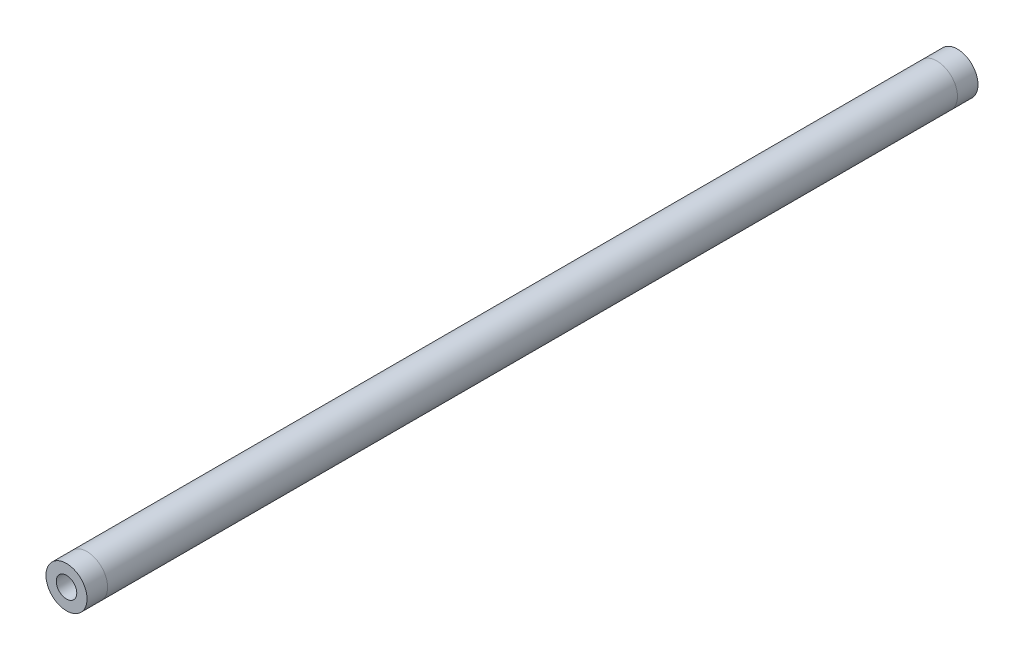
ISO-10303-21;
HEADER;
FILE_DESCRIPTION(('STEP AP214'),'2;1');
FILE_NAME('part.step','',(''),(''),'','','');
FILE_SCHEMA(('AUTOMOTIVE_DESIGN { 1 0 10303 214 1 1 1 1 }'));
ENDSEC;
DATA;
#1=APPLICATION_CONTEXT('core data for automotive mechanical design processes');
#2=APPLICATION_PROTOCOL_DEFINITION('international standard','automotive_design',2000,#1);
#3=PRODUCT_CONTEXT('',#1,'mechanical');
#4=PRODUCT('Part','Part','',(#3));
#5=PRODUCT_RELATED_PRODUCT_CATEGORY('part','',(#4));
#6=PRODUCT_DEFINITION_FORMATION('','',#4);
#7=PRODUCT_DEFINITION_CONTEXT('part definition',#1,'design');
#8=PRODUCT_DEFINITION('design','',#6,#7);
#9=PRODUCT_DEFINITION_SHAPE('','',#8);
#10=(LENGTH_UNIT() NAMED_UNIT(*) SI_UNIT(.MILLI.,.METRE.));
#11=(NAMED_UNIT(*) PLANE_ANGLE_UNIT() SI_UNIT($,.RADIAN.));
#12=(NAMED_UNIT(*) SI_UNIT($,.STERADIAN.) SOLID_ANGLE_UNIT());
#13=UNCERTAINTY_MEASURE_WITH_UNIT(LENGTH_MEASURE(1.E-05),#10,'distance_accuracy_value','');
#14=(GEOMETRIC_REPRESENTATION_CONTEXT(3) GLOBAL_UNCERTAINTY_ASSIGNED_CONTEXT((#13)) GLOBAL_UNIT_ASSIGNED_CONTEXT((#10,
#11,#12)) REPRESENTATION_CONTEXT('',''));
#15=CARTESIAN_POINT('',(0.,0.,0.));
#16=DIRECTION('',(0.,0.,1.));
#17=DIRECTION('',(1.,0.,0.));
#18=AXIS2_PLACEMENT_3D('',#15,#16,#17);
#19=CARTESIAN_POINT('',(0.,0.,-275.389417953208));
#20=DIRECTION('',(0.,0.,1.));
#21=DIRECTION('',(1.,0.,0.));
#22=AXIS2_PLACEMENT_3D('',#19,#20,#21);
#23=CYLINDRICAL_SURFACE('',#22,6.35);
#24=CARTESIAN_POINT('',(0.,0.,-275.389417953208));
#25=DIRECTION('',(0.,0.,1.));
#26=DIRECTION('',(1.,0.,0.));
#27=AXIS2_PLACEMENT_3D('',#24,#25,#26);
#28=CIRCLE('',#27,6.35);
#29=CARTESIAN_POINT('',(6.35,0.,-275.389417953208));
#30=VERTEX_POINT('',#29);
#31=EDGE_CURVE('E83',#30,#30,#28,.T.);
#32=ORIENTED_EDGE('',*,*,#31,.T.);
#33=EDGE_LOOP('',(#32));
#34=FACE_BOUND('',#33,.T.);
#35=CARTESIAN_POINT('',(0.,0.,-269.039417953208));
#36=DIRECTION('',(0.,0.,1.));
#37=DIRECTION('',(1.,0.,0.));
#38=AXIS2_PLACEMENT_3D('',#35,#36,#37);
#39=CIRCLE('',#38,6.35);
#40=CARTESIAN_POINT('',(6.35,0.,-269.039417953208));
#41=VERTEX_POINT('',#40);
#42=EDGE_CURVE('E79',#41,#41,#39,.T.);
#43=ORIENTED_EDGE('',*,*,#42,.F.);
#44=EDGE_LOOP('',(#43));
#45=FACE_BOUND('',#44,.T.);
#46=ADVANCED_FACE('F76',(#34,#45),#23,.T.);
#47=CARTESIAN_POINT('',(0.,0.,-275.389417953208));
#48=DIRECTION('',(0.,0.,1.));
#49=DIRECTION('',(1.,0.,0.));
#50=AXIS2_PLACEMENT_3D('',#47,#48,#49);
#51=PLANE('',#50);
#52=CARTESIAN_POINT('',(0.,0.,-275.389417953208));
#53=DIRECTION('',(0.,0.,1.));
#54=DIRECTION('',(1.,0.,0.));
#55=AXIS2_PLACEMENT_3D('',#52,#53,#54);
#56=CIRCLE('',#55,3.175);
#57=CARTESIAN_POINT('',(3.175,0.,-275.389417953208));
#58=VERTEX_POINT('',#57);
#59=EDGE_CURVE('E92',#58,#58,#56,.T.);
#60=ORIENTED_EDGE('',*,*,#59,.T.);
#61=EDGE_LOOP('',(#60));
#62=FACE_BOUND('',#61,.T.);
#63=ORIENTED_EDGE('',*,*,#31,.F.);
#64=EDGE_LOOP('',(#63));
#65=FACE_BOUND('',#64,.T.);
#66=ADVANCED_FACE('F119',(#62,#65),#51,.F.);
#67=CARTESIAN_POINT('',(0.,0.,-269.039417953208));
#68=DIRECTION('',(0.,0.,1.));
#69=DIRECTION('',(1.,0.,0.));
#70=AXIS2_PLACEMENT_3D('',#67,#68,#69);
#71=PLANE('',#70);
#72=CARTESIAN_POINT('',(0.,0.,-269.039417953208));
#73=DIRECTION('',(0.,0.,1.));
#74=DIRECTION('',(1.,0.,0.));
#75=AXIS2_PLACEMENT_3D('',#72,#73,#74);
#76=CIRCLE('',#75,4.826);
#77=CARTESIAN_POINT('',(-4.826,0.,-269.039417953208));
#78=VERTEX_POINT('',#77);
#79=EDGE_CURVE('E12',#78,#78,#76,.T.);
#80=ORIENTED_EDGE('',*,*,#79,.F.);
#81=EDGE_LOOP('',(#80));
#82=FACE_BOUND('',#81,.T.);
#83=ORIENTED_EDGE('',*,*,#42,.T.);
#84=EDGE_LOOP('',(#83));
#85=FACE_BOUND('',#84,.T.);
#86=ADVANCED_FACE('F115',(#82,#85),#71,.T.);
#87=CARTESIAN_POINT('',(0.,0.,-275.389417953208));
#88=DIRECTION('',(0.,0.,1.));
#89=DIRECTION('',(1.,0.,0.));
#90=AXIS2_PLACEMENT_3D('',#87,#88,#89);
#91=CYLINDRICAL_SURFACE('',#90,3.175);
#92=ORIENTED_EDGE('',*,*,#59,.F.);
#93=EDGE_LOOP('',(#92));
#94=FACE_BOUND('',#93,.T.);
#95=CARTESIAN_POINT('',(0.,0.,-259.514417953208));
#96=DIRECTION('',(0.,0.,1.));
#97=DIRECTION('',(1.,0.,0.));
#98=AXIS2_PLACEMENT_3D('',#95,#96,#97);
#99=CIRCLE('',#98,3.175);
#100=CARTESIAN_POINT('',(3.175,0.,-259.514417953208));
#101=VERTEX_POINT('',#100);
#102=EDGE_CURVE('E98',#101,#101,#99,.T.);
#103=ORIENTED_EDGE('',*,*,#102,.T.);
#104=EDGE_LOOP('',(#103));
#105=FACE_BOUND('',#104,.T.);
#106=ADVANCED_FACE('F104',(#94,#105),#91,.F.);
#107=CARTESIAN_POINT('',(0.,0.,-259.514417953208));
#108=DIRECTION('',(0.,0.,1.));
#109=DIRECTION('',(1.,0.,0.));
#110=AXIS2_PLACEMENT_3D('',#107,#108,#109);
#111=PLANE('',#110);
#112=CARTESIAN_POINT('',(0.,0.,-259.514417953208));
#113=DIRECTION('',(0.,0.,1.));
#114=DIRECTION('',(1.,0.,0.));
#115=AXIS2_PLACEMENT_3D('',#112,#113,#114);
#116=CIRCLE('',#115,4.826);
#117=CARTESIAN_POINT('',(-4.826,0.,-259.514417953208));
#118=VERTEX_POINT('',#117);
#119=EDGE_CURVE('E90',#118,#118,#116,.T.);
#120=ORIENTED_EDGE('',*,*,#119,.T.);
#121=EDGE_LOOP('',(#120));
#122=FACE_BOUND('',#121,.T.);
#123=ORIENTED_EDGE('',*,*,#102,.F.);
#124=EDGE_LOOP('',(#123));
#125=FACE_BOUND('',#124,.T.);
#126=ADVANCED_FACE('F106',(#122,#125),#111,.T.);
#127=CARTESIAN_POINT('',(0.,0.,-259.514417953208));
#128=DIRECTION('',(0.,0.,-1.));
#129=DIRECTION('',(-1.,0.,0.));
#130=AXIS2_PLACEMENT_3D('',#127,#128,#129);
#131=CYLINDRICAL_SURFACE('',#130,4.826);
#132=CARTESIAN_POINT('',(-4.826,0.,-259.514417953208));
#133=CARTESIAN_POINT('',(-4.826,0.,-259.613636703208));
#134=CARTESIAN_POINT('',(-4.826,0.,-259.712855453208));
#135=CARTESIAN_POINT('',(-4.826,0.,-259.911292953208));
#136=CARTESIAN_POINT('',(-4.826,0.,-260.010511703208));
#137=CARTESIAN_POINT('',(-4.826,0.,-260.208949203208));
#138=CARTESIAN_POINT('',(-4.826,0.,-260.308167953208));
#139=CARTESIAN_POINT('',(-4.826,0.,-260.506605453208));
#140=CARTESIAN_POINT('',(-4.826,0.,-260.605824203208));
#141=CARTESIAN_POINT('',(-4.826,0.,-260.804261703208));
#142=CARTESIAN_POINT('',(-4.826,0.,-260.903480453208));
#143=CARTESIAN_POINT('',(-4.826,0.,-261.101917953208));
#144=CARTESIAN_POINT('',(-4.826,0.,-261.201136703208));
#145=CARTESIAN_POINT('',(-4.826,0.,-261.399574203208));
#146=CARTESIAN_POINT('',(-4.826,0.,-261.498792953208));
#147=CARTESIAN_POINT('',(-4.826,0.,-261.697230453208));
#148=CARTESIAN_POINT('',(-4.826,0.,-261.796449203208));
#149=CARTESIAN_POINT('',(-4.826,0.,-261.994886703208));
#150=CARTESIAN_POINT('',(-4.826,0.,-262.094105453208));
#151=CARTESIAN_POINT('',(-4.826,0.,-262.292542953208));
#152=CARTESIAN_POINT('',(-4.826,0.,-262.391761703208));
#153=CARTESIAN_POINT('',(-4.826,0.,-262.590199203208));
#154=CARTESIAN_POINT('',(-4.826,0.,-262.689417953208));
#155=CARTESIAN_POINT('',(-4.826,0.,-262.887855453208));
#156=CARTESIAN_POINT('',(-4.826,0.,-262.987074203208));
#157=CARTESIAN_POINT('',(-4.826,0.,-263.185511703208));
#158=CARTESIAN_POINT('',(-4.826,0.,-263.284730453208));
#159=CARTESIAN_POINT('',(-4.826,0.,-263.483167953208));
#160=CARTESIAN_POINT('',(-4.826,0.,-263.582386703208));
#161=CARTESIAN_POINT('',(-4.826,0.,-263.780824203208));
#162=CARTESIAN_POINT('',(-4.826,0.,-263.880042953208));
#163=CARTESIAN_POINT('',(-4.826,0.,-264.078480453208));
#164=CARTESIAN_POINT('',(-4.826,0.,-264.177699203208));
#165=CARTESIAN_POINT('',(-4.826,0.,-264.376136703208));
#166=CARTESIAN_POINT('',(-4.826,0.,-264.475355453208));
#167=CARTESIAN_POINT('',(-4.826,0.,-264.673792953208));
#168=CARTESIAN_POINT('',(-4.826,0.,-264.773011703208));
#169=CARTESIAN_POINT('',(-4.826,0.,-264.971449203208));
#170=CARTESIAN_POINT('',(-4.826,0.,-265.070667953208));
#171=CARTESIAN_POINT('',(-4.826,0.,-265.269105453208));
#172=CARTESIAN_POINT('',(-4.826,0.,-265.368324203208));
#173=CARTESIAN_POINT('',(-4.826,0.,-265.566761703208));
#174=CARTESIAN_POINT('',(-4.826,0.,-265.665980453208));
#175=CARTESIAN_POINT('',(-4.826,0.,-265.864417953208));
#176=CARTESIAN_POINT('',(-4.826,0.,-265.963636703208));
#177=CARTESIAN_POINT('',(-4.826,0.,-266.162074203208));
#178=CARTESIAN_POINT('',(-4.826,0.,-266.261292953208));
#179=CARTESIAN_POINT('',(-4.826,0.,-266.459730453208));
#180=CARTESIAN_POINT('',(-4.826,0.,-266.558949203208));
#181=CARTESIAN_POINT('',(-4.826,0.,-266.757386703208));
#182=CARTESIAN_POINT('',(-4.826,0.,-266.856605453208));
#183=CARTESIAN_POINT('',(-4.826,0.,-267.055042953208));
#184=CARTESIAN_POINT('',(-4.826,0.,-267.154261703208));
#185=CARTESIAN_POINT('',(-4.826,0.,-267.352699203208));
#186=CARTESIAN_POINT('',(-4.826,0.,-267.451917953208));
#187=CARTESIAN_POINT('',(-4.826,0.,-267.650355453208));
#188=CARTESIAN_POINT('',(-4.826,0.,-267.749574203208));
#189=CARTESIAN_POINT('',(-4.826,0.,-267.948011703208));
#190=CARTESIAN_POINT('',(-4.826,0.,-268.047230453208));
#191=CARTESIAN_POINT('',(-4.826,0.,-268.245667953208));
#192=CARTESIAN_POINT('',(-4.826,0.,-268.344886703208));
#193=CARTESIAN_POINT('',(-4.826,0.,-268.543324203208));
#194=CARTESIAN_POINT('',(-4.826,0.,-268.642542953208));
#195=CARTESIAN_POINT('',(-4.826,0.,-268.840980453208));
#196=CARTESIAN_POINT('',(-4.826,0.,-268.940199203208));
#197=CARTESIAN_POINT('',(-4.826,0.,-269.039417953208));
#198=B_SPLINE_CURVE_WITH_KNOTS('',3,(#132,#133,#134,#135,#136,#137,#138,#139,#140,#141,#142,
#143,#144,#145,#146,#147,#148,#149,#150,#151,#152,#153,#154,#155,#156,#157,#158,#159,#160,#161,
#162,#163,#164,#165,#166,#167,#168,#169,#170,#171,#172,#173,#174,#175,#176,#177,#178,#179,#180,
#181,#182,#183,#184,#185,#186,#187,#188,#189,#190,#191,#192,#193,#194,#195,#196,#197),
.UNSPECIFIED.,.F.,.F.,(4,2,2,2,2,2,2,2,2,2,2,2,2,2,2,2,2,2,2,2,2,2,2,2,2,2,2,2,2,2,2,2,4),(0.,
0.29765625,0.5953125,0.892968750000001,1.190625,1.48828125,1.7859375,2.08359375,2.38125,
2.67890625,2.9765625,3.27421875,3.571875,3.86953125,4.1671875,4.46484375,4.7625,5.06015625,
5.3578125,5.65546875,5.953125,6.25078125,6.5484375,6.84609375,7.14375,7.44140625,7.7390625,
8.03671875000001,8.334375,8.63203125,8.92968750000001,9.22734375000001,9.52500000000001),.UNSPECIFIED.);
#199=EDGE_CURVE('BSEAM108',#118,#78,#198,.T.);
#200=ORIENTED_EDGE('',*,*,#119,.F.);
#201=ORIENTED_EDGE('',*,*,#79,.T.);
#202=ORIENTED_EDGE('',*,*,#199,.T.);
#203=ORIENTED_EDGE('',*,*,#199,.F.);
#204=EDGE_LOOP('',(#200,#202,#201,#203));
#205=FACE_BOUND('',#204,.T.);
#206=ADVANCED_FACE('F108',(#205),#131,.T.);
#207=CLOSED_SHELL('',(#46,#66,#86,#106,#126,#206));
#208=MANIFOLD_SOLID_BREP('B2',#207);
#209=CARTESIAN_POINT('',(0.,0.,-269.039417953208));
#210=DIRECTION('',(0.,0.,1.));
#211=DIRECTION('',(1.,0.,0.));
#212=AXIS2_PLACEMENT_3D('',#209,#210,#211);
#213=CYLINDRICAL_SURFACE('',#212,6.35);
#214=CARTESIAN_POINT('',(0.,0.,-269.039417953208));
#215=DIRECTION('',(0.,0.,1.));
#216=DIRECTION('',(1.,0.,0.));
#217=AXIS2_PLACEMENT_3D('',#214,#215,#216);
#218=CIRCLE('',#217,6.35);
#219=CARTESIAN_POINT('',(6.35,0.,-269.039417953208));
#220=VERTEX_POINT('',#219);
#221=EDGE_CURVE('E75',#220,#220,#218,.T.);
#222=ORIENTED_EDGE('',*,*,#221,.T.);
#223=EDGE_LOOP('',(#222));
#224=FACE_BOUND('',#223,.T.);
#225=CARTESIAN_POINT('',(0.,0.,-6.35));
#226=DIRECTION('',(0.,0.,1.));
#227=DIRECTION('',(1.,0.,0.));
#228=AXIS2_PLACEMENT_3D('',#225,#226,#227);
#229=CIRCLE('',#228,6.35);
#230=CARTESIAN_POINT('',(6.35,0.,-6.35));
#231=VERTEX_POINT('',#230);
#232=EDGE_CURVE('E191',#231,#231,#229,.T.);
#233=ORIENTED_EDGE('',*,*,#232,.F.);
#234=EDGE_LOOP('',(#233));
#235=FACE_BOUND('',#234,.T.);
#236=ADVANCED_FACE('F188',(#224,#235),#213,.T.);
#237=CARTESIAN_POINT('',(0.,0.,-269.039417953208));
#238=DIRECTION('',(0.,0.,1.));
#239=DIRECTION('',(1.,0.,0.));
#240=AXIS2_PLACEMENT_3D('',#237,#238,#239);
#241=PLANE('',#240);
#242=CARTESIAN_POINT('',(0.,0.,-269.039417953208));
#243=DIRECTION('',(0.,0.,1.));
#244=DIRECTION('',(1.,0.,0.));
#245=AXIS2_PLACEMENT_3D('',#242,#243,#244);
#246=CIRCLE('',#245,4.826);
#247=CARTESIAN_POINT('',(4.826,0.,-269.039417953208));
#248=VERTEX_POINT('',#247);
#249=EDGE_CURVE('E198',#248,#248,#246,.T.);
#250=ORIENTED_EDGE('',*,*,#249,.T.);
#251=EDGE_LOOP('',(#250));
#252=FACE_BOUND('',#251,.T.);
#253=ORIENTED_EDGE('',*,*,#221,.F.);
#254=EDGE_LOOP('',(#253));
#255=FACE_BOUND('',#254,.T.);
#256=ADVANCED_FACE('F206',(#252,#255),#241,.F.);
#257=CARTESIAN_POINT('',(0.,0.,-6.35));
#258=DIRECTION('',(0.,0.,1.));
#259=DIRECTION('',(1.,0.,0.));
#260=AXIS2_PLACEMENT_3D('',#257,#258,#259);
#261=PLANE('',#260);
#262=CARTESIAN_POINT('',(0.,0.,-6.35));
#263=DIRECTION('',(0.,0.,1.));
#264=DIRECTION('',(1.,0.,0.));
#265=AXIS2_PLACEMENT_3D('',#262,#263,#264);
#266=CIRCLE('',#265,4.826);
#267=CARTESIAN_POINT('',(4.826,0.,-6.35));
#268=VERTEX_POINT('',#267);
#269=EDGE_CURVE('E200',#268,#268,#266,.T.);
#270=ORIENTED_EDGE('',*,*,#269,.F.);
#271=EDGE_LOOP('',(#270));
#272=FACE_BOUND('',#271,.T.);
#273=ORIENTED_EDGE('',*,*,#232,.T.);
#274=EDGE_LOOP('',(#273));
#275=FACE_BOUND('',#274,.T.);
#276=ADVANCED_FACE('F212',(#272,#275),#261,.T.);
#277=CARTESIAN_POINT('',(0.,0.,-269.039417953208));
#278=DIRECTION('',(0.,0.,1.));
#279=DIRECTION('',(1.,0.,0.));
#280=AXIS2_PLACEMENT_3D('',#277,#278,#279);
#281=CYLINDRICAL_SURFACE('',#280,4.826);
#282=ORIENTED_EDGE('',*,*,#249,.F.);
#283=EDGE_LOOP('',(#282));
#284=FACE_BOUND('',#283,.T.);
#285=ORIENTED_EDGE('',*,*,#269,.T.);
#286=EDGE_LOOP('',(#285));
#287=FACE_BOUND('',#286,.T.);
#288=ADVANCED_FACE('F209',(#284,#287),#281,.F.);
#289=CLOSED_SHELL('',(#236,#256,#276,#288));
#290=MANIFOLD_SOLID_BREP('B7',#289);
#291=CARTESIAN_POINT('',(0.,0.,-6.35));
#292=DIRECTION('',(0.,0.,1.));
#293=DIRECTION('',(1.,0.,0.));
#294=AXIS2_PLACEMENT_3D('',#291,#292,#293);
#295=CYLINDRICAL_SURFACE('',#294,6.35);
#296=CARTESIAN_POINT('',(0.,0.,-6.35));
#297=DIRECTION('',(0.,0.,1.));
#298=DIRECTION('',(1.,0.,0.));
#299=AXIS2_PLACEMENT_3D('',#296,#297,#298);
#300=CIRCLE('',#299,6.35);
#301=CARTESIAN_POINT('',(6.35,0.,-6.35));
#302=VERTEX_POINT('',#301);
#303=EDGE_CURVE('E187',#302,#302,#300,.T.);
#304=ORIENTED_EDGE('',*,*,#303,.T.);
#305=EDGE_LOOP('',(#304));
#306=FACE_BOUND('',#305,.T.);
#307=CARTESIAN_POINT('',(0.,0.,0.));
#308=DIRECTION('',(0.,0.,1.));
#309=DIRECTION('',(1.,0.,0.));
#310=AXIS2_PLACEMENT_3D('',#307,#308,#309);
#311=CIRCLE('',#310,6.35);
#312=CARTESIAN_POINT('',(6.35,0.,0.));
#313=VERTEX_POINT('',#312);
#314=EDGE_CURVE('E261',#313,#313,#311,.T.);
#315=ORIENTED_EDGE('',*,*,#314,.F.);
#316=EDGE_LOOP('',(#315));
#317=FACE_BOUND('',#316,.T.);
#318=ADVANCED_FACE('F250',(#306,#317),#295,.T.);
#319=CARTESIAN_POINT('',(0.,0.,-6.35));
#320=DIRECTION('',(0.,0.,1.));
#321=DIRECTION('',(1.,0.,0.));
#322=AXIS2_PLACEMENT_3D('',#319,#320,#321);
#323=CYLINDRICAL_SURFACE('',#322,3.175);
#324=CARTESIAN_POINT('',(0.,0.,0.));
#325=DIRECTION('',(0.,0.,1.));
#326=DIRECTION('',(1.,0.,0.));
#327=AXIS2_PLACEMENT_3D('',#324,#325,#326);
#328=CIRCLE('',#327,3.175);
#329=CARTESIAN_POINT('',(3.175,0.,0.));
#330=VERTEX_POINT('',#329);
#331=EDGE_CURVE('E253',#330,#330,#328,.T.);
#332=ORIENTED_EDGE('',*,*,#331,.T.);
#333=EDGE_LOOP('',(#332));
#334=FACE_BOUND('',#333,.T.);
#335=CARTESIAN_POINT('',(0.,0.,-15.875));
#336=DIRECTION('',(0.,0.,1.));
#337=DIRECTION('',(1.,0.,0.));
#338=AXIS2_PLACEMENT_3D('',#335,#336,#337);
#339=CIRCLE('',#338,3.175);
#340=CARTESIAN_POINT('',(3.175,0.,-15.875));
#341=VERTEX_POINT('',#340);
#342=EDGE_CURVE('E273',#341,#341,#339,.T.);
#343=ORIENTED_EDGE('',*,*,#342,.F.);
#344=EDGE_LOOP('',(#343));
#345=FACE_BOUND('',#344,.T.);
#346=ADVANCED_FACE('F281',(#334,#345),#323,.F.);
#347=CARTESIAN_POINT('',(0.,0.,-6.35));
#348=DIRECTION('',(0.,0.,1.));
#349=DIRECTION('',(1.,0.,0.));
#350=AXIS2_PLACEMENT_3D('',#347,#348,#349);
#351=PLANE('',#350);
#352=CARTESIAN_POINT('',(0.,0.,-6.35));
#353=DIRECTION('',(0.,0.,1.));
#354=DIRECTION('',(1.,0.,0.));
#355=AXIS2_PLACEMENT_3D('',#352,#353,#354);
#356=CIRCLE('',#355,4.826);
#357=CARTESIAN_POINT('',(4.826,0.,-6.35));
#358=VERTEX_POINT('',#357);
#359=EDGE_CURVE('E263',#358,#358,#356,.T.);
#360=ORIENTED_EDGE('',*,*,#359,.T.);
#361=EDGE_LOOP('',(#360));
#362=FACE_BOUND('',#361,.T.);
#363=ORIENTED_EDGE('',*,*,#303,.F.);
#364=EDGE_LOOP('',(#363));
#365=FACE_BOUND('',#364,.T.);
#366=ADVANCED_FACE('F283',(#362,#365),#351,.F.);
#367=CARTESIAN_POINT('',(0.,0.,0.));
#368=DIRECTION('',(0.,0.,1.));
#369=DIRECTION('',(1.,0.,0.));
#370=AXIS2_PLACEMENT_3D('',#367,#368,#369);
#371=PLANE('',#370);
#372=ORIENTED_EDGE('',*,*,#314,.T.);
#373=EDGE_LOOP('',(#372));
#374=FACE_BOUND('',#373,.T.);
#375=ORIENTED_EDGE('',*,*,#331,.F.);
#376=EDGE_LOOP('',(#375));
#377=FACE_BOUND('',#376,.T.);
#378=ADVANCED_FACE('F289',(#374,#377),#371,.T.);
#379=CARTESIAN_POINT('',(0.,0.,-15.875));
#380=DIRECTION('',(0.,0.,1.));
#381=DIRECTION('',(1.,0.,0.));
#382=AXIS2_PLACEMENT_3D('',#379,#380,#381);
#383=CYLINDRICAL_SURFACE('',#382,4.826);
#384=CARTESIAN_POINT('',(0.,0.,-15.875));
#385=DIRECTION('',(0.,0.,1.));
#386=DIRECTION('',(1.,0.,0.));
#387=AXIS2_PLACEMENT_3D('',#384,#385,#386);
#388=CIRCLE('',#387,4.826);
#389=CARTESIAN_POINT('',(4.826,0.,-15.875));
#390=VERTEX_POINT('',#389);
#391=EDGE_CURVE('E266',#390,#390,#388,.T.);
#392=CARTESIAN_POINT('',(4.826,0.,-15.875));
#393=CARTESIAN_POINT('',(4.826,0.,-15.77578125));
#394=CARTESIAN_POINT('',(4.826,0.,-15.6765625));
#395=CARTESIAN_POINT('',(4.826,0.,-15.478125));
#396=CARTESIAN_POINT('',(4.826,0.,-15.37890625));
#397=CARTESIAN_POINT('',(4.826,0.,-15.18046875));
#398=CARTESIAN_POINT('',(4.826,0.,-15.08125));
#399=CARTESIAN_POINT('',(4.826,0.,-14.8828125));
#400=CARTESIAN_POINT('',(4.826,0.,-14.78359375));
#401=CARTESIAN_POINT('',(4.826,0.,-14.58515625));
#402=CARTESIAN_POINT('',(4.826,0.,-14.4859375));
#403=CARTESIAN_POINT('',(4.826,0.,-14.2875));
#404=CARTESIAN_POINT('',(4.826,0.,-14.18828125));
#405=CARTESIAN_POINT('',(4.826,0.,-13.98984375));
#406=CARTESIAN_POINT('',(4.826,0.,-13.890625));
#407=CARTESIAN_POINT('',(4.826,0.,-13.6921875));
#408=CARTESIAN_POINT('',(4.826,0.,-13.59296875));
#409=CARTESIAN_POINT('',(4.826,0.,-13.39453125));
#410=CARTESIAN_POINT('',(4.826,0.,-13.2953125));
#411=CARTESIAN_POINT('',(4.826,0.,-13.096875));
#412=CARTESIAN_POINT('',(4.826,0.,-12.99765625));
#413=CARTESIAN_POINT('',(4.826,0.,-12.79921875));
#414=CARTESIAN_POINT('',(4.826,0.,-12.7));
#415=CARTESIAN_POINT('',(4.826,0.,-12.5015625));
#416=CARTESIAN_POINT('',(4.826,0.,-12.40234375));
#417=CARTESIAN_POINT('',(4.826,0.,-12.20390625));
#418=CARTESIAN_POINT('',(4.826,0.,-12.1046875));
#419=CARTESIAN_POINT('',(4.826,0.,-11.90625));
#420=CARTESIAN_POINT('',(4.826,0.,-11.80703125));
#421=CARTESIAN_POINT('',(4.826,0.,-11.60859375));
#422=CARTESIAN_POINT('',(4.826,0.,-11.509375));
#423=CARTESIAN_POINT('',(4.826,0.,-11.3109375));
#424=CARTESIAN_POINT('',(4.826,0.,-11.21171875));
#425=CARTESIAN_POINT('',(4.826,0.,-11.01328125));
#426=CARTESIAN_POINT('',(4.826,0.,-10.9140625));
#427=CARTESIAN_POINT('',(4.826,0.,-10.715625));
#428=CARTESIAN_POINT('',(4.826,0.,-10.61640625));
#429=CARTESIAN_POINT('',(4.826,0.,-10.41796875));
#430=CARTESIAN_POINT('',(4.826,0.,-10.31875));
#431=CARTESIAN_POINT('',(4.826,0.,-10.1203125));
#432=CARTESIAN_POINT('',(4.826,0.,-10.02109375));
#433=CARTESIAN_POINT('',(4.826,0.,-9.82265625));
#434=CARTESIAN_POINT('',(4.826,0.,-9.7234375));
#435=CARTESIAN_POINT('',(4.826,0.,-9.525));
#436=CARTESIAN_POINT('',(4.826,0.,-9.42578125));
#437=CARTESIAN_POINT('',(4.826,0.,-9.22734375));
#438=CARTESIAN_POINT('',(4.826,0.,-9.128125));
#439=CARTESIAN_POINT('',(4.826,0.,-8.9296875));
#440=CARTESIAN_POINT('',(4.826,0.,-8.83046875));
#441=CARTESIAN_POINT('',(4.826,0.,-8.63203125));
#442=CARTESIAN_POINT('',(4.826,0.,-8.5328125));
#443=CARTESIAN_POINT('',(4.826,0.,-8.334375));
#444=CARTESIAN_POINT('',(4.826,0.,-8.23515625));
#445=CARTESIAN_POINT('',(4.826,0.,-8.03671875));
#446=CARTESIAN_POINT('',(4.826,0.,-7.9375));
#447=CARTESIAN_POINT('',(4.826,0.,-7.7390625));
#448=CARTESIAN_POINT('',(4.826,0.,-7.63984375));
#449=CARTESIAN_POINT('',(4.826,0.,-7.44140625));
#450=CARTESIAN_POINT('',(4.826,0.,-7.3421875));
#451=CARTESIAN_POINT('',(4.826,0.,-7.14375));
#452=CARTESIAN_POINT('',(4.826,0.,-7.04453125));
#453=CARTESIAN_POINT('',(4.826,0.,-6.84609375));
#454=CARTESIAN_POINT('',(4.826,0.,-6.746875));
#455=CARTESIAN_POINT('',(4.826,0.,-6.5484375));
#456=CARTESIAN_POINT('',(4.826,0.,-6.44921875));
#457=CARTESIAN_POINT('',(4.826,0.,-6.35));
#458=B_SPLINE_CURVE_WITH_KNOTS('',3,(#392,#393,#394,#395,#396,#397,#398,#399,#400,#401,#402,
#403,#404,#405,#406,#407,#408,#409,#410,#411,#412,#413,#414,#415,#416,#417,#418,#419,#420,#421,
#422,#423,#424,#425,#426,#427,#428,#429,#430,#431,#432,#433,#434,#435,#436,#437,#438,#439,#440,
#441,#442,#443,#444,#445,#446,#447,#448,#449,#450,#451,#452,#453,#454,#455,#456,#457),
.UNSPECIFIED.,.F.,.F.,(4,2,2,2,2,2,2,2,2,2,2,2,2,2,2,2,2,2,2,2,2,2,2,2,2,2,2,2,2,2,2,2,4),(0.,
0.297656250000002,0.595312500000002,0.892968750000002,1.190625,1.48828125,1.7859375,2.08359375,
2.38125,2.67890625,2.9765625,3.27421875,3.571875,3.86953125,4.1671875,4.46484375,4.7625,
5.06015625,5.3578125,5.65546875,5.953125,6.25078125,6.5484375,6.84609375,7.14375,7.44140625,
7.7390625,8.03671875,8.334375,8.63203125,8.9296875,9.22734375,9.525),.UNSPECIFIED.);
#459=EDGE_CURVE('BSEAM294',#390,#358,#458,.T.);
#460=ORIENTED_EDGE('',*,*,#391,.T.);
#461=ORIENTED_EDGE('',*,*,#359,.F.);
#462=ORIENTED_EDGE('',*,*,#459,.T.);
#463=ORIENTED_EDGE('',*,*,#459,.F.);
#464=EDGE_LOOP('',(#460,#462,#461,#463));
#465=FACE_BOUND('',#464,.T.);
#466=ADVANCED_FACE('F294',(#465),#383,.T.);
#467=CARTESIAN_POINT('',(0.,0.,-15.875));
#468=DIRECTION('',(0.,0.,1.));
#469=DIRECTION('',(1.,0.,0.));
#470=AXIS2_PLACEMENT_3D('',#467,#468,#469);
#471=PLANE('',#470);
#472=ORIENTED_EDGE('',*,*,#342,.T.);
#473=EDGE_LOOP('',(#472));
#474=FACE_BOUND('',#473,.T.);
#475=ORIENTED_EDGE('',*,*,#391,.F.);
#476=EDGE_LOOP('',(#475));
#477=FACE_BOUND('',#476,.T.);
#478=ADVANCED_FACE('F278',(#474,#477),#471,.F.);
#479=CLOSED_SHELL('',(#318,#346,#366,#378,#466,#478));
#480=MANIFOLD_SOLID_BREP('B70',#479);
#481=ADVANCED_BREP_SHAPE_REPRESENTATION('',(#18,#208,#290,#480),#14);
#482=SHAPE_DEFINITION_REPRESENTATION(#9,#481);
ENDSEC;
END-ISO-10303-21;
